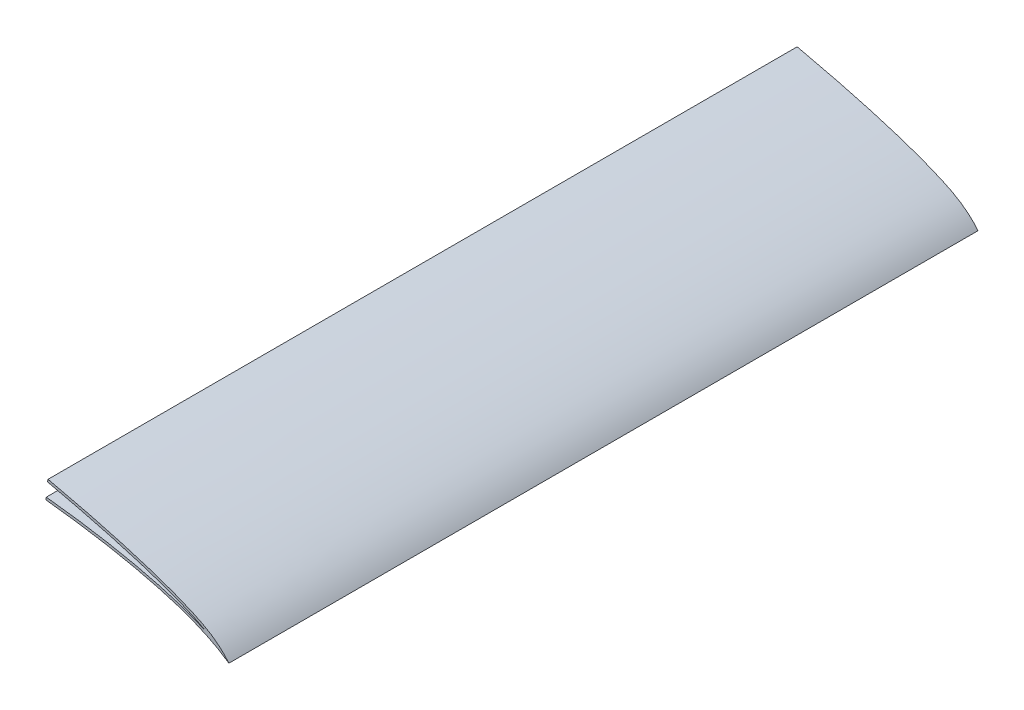
ISO-10303-21;
HEADER;
FILE_DESCRIPTION(('STEP AP214'),'2;1');
FILE_NAME('part.step','',(''),(''),'','','');
FILE_SCHEMA(('AUTOMOTIVE_DESIGN { 1 0 10303 214 1 1 1 1 }'));
ENDSEC;
DATA;
#1=APPLICATION_CONTEXT('core data for automotive mechanical design processes');
#2=APPLICATION_PROTOCOL_DEFINITION('international standard','automotive_design',2000,#1);
#3=PRODUCT_CONTEXT('',#1,'mechanical');
#4=PRODUCT('Part','Part','',(#3));
#5=PRODUCT_RELATED_PRODUCT_CATEGORY('part','',(#4));
#6=PRODUCT_DEFINITION_FORMATION('','',#4);
#7=PRODUCT_DEFINITION_CONTEXT('part definition',#1,'design');
#8=PRODUCT_DEFINITION('design','',#6,#7);
#9=PRODUCT_DEFINITION_SHAPE('','',#8);
#10=(LENGTH_UNIT() NAMED_UNIT(*) SI_UNIT(.MILLI.,.METRE.));
#11=(NAMED_UNIT(*) PLANE_ANGLE_UNIT() SI_UNIT($,.RADIAN.));
#12=(NAMED_UNIT(*) SI_UNIT($,.STERADIAN.) SOLID_ANGLE_UNIT());
#13=UNCERTAINTY_MEASURE_WITH_UNIT(LENGTH_MEASURE(1.E-05),#10,'distance_accuracy_value','');
#14=(GEOMETRIC_REPRESENTATION_CONTEXT(3) GLOBAL_UNCERTAINTY_ASSIGNED_CONTEXT((#13)) GLOBAL_UNIT_ASSIGNED_CONTEXT((#10,
#11,#12)) REPRESENTATION_CONTEXT('',''));
#15=CARTESIAN_POINT('',(0.,0.,0.));
#16=DIRECTION('',(0.,0.,1.));
#17=DIRECTION('',(1.,0.,0.));
#18=AXIS2_PLACEMENT_3D('',#15,#16,#17);
#19=CARTESIAN_POINT('',(681.10239979939,357.442024641771,776.88119407791));
#20=CARTESIAN_POINT('',(679.304249684024,358.507222216952,776.88119407791));
#21=CARTESIAN_POINT('',(675.611115854921,360.442697269166,776.88119407791));
#22=CARTESIAN_POINT('',(667.897968409566,363.914761834944,776.88119407791));
#23=CARTESIAN_POINT('',(658.02890147387,367.768621452563,776.88119407791));
#24=CARTESIAN_POINT('',(645.962941296988,371.875785824504,776.88119407791));
#25=CARTESIAN_POINT('',(629.698668264069,376.857765233191,776.88119407791));
#26=CARTESIAN_POINT('',(609.14271959352,382.390632282122,776.88119407791));
#27=CARTESIAN_POINT('',(592.558644621646,386.308749724352,776.88119407791));
#28=CARTESIAN_POINT('',(584.246414259336,388.168240850974,776.88119407791));
#29=B_SPLINE_CURVE_WITH_KNOTS('',3,(#19,#20,#21,#22,#23,#24,#25,#26,#27,#28),.UNSPECIFIED.,.F.,
.F.,(4,1,1,1,1,1,1,4),(0.0310566948795872,0.0410473310177227,0.0510379671558582,
0.0710192394321292,0.0910005117084002,0.110981783984671,0.150944328537213,0.190906873089755),.UNSPECIFIED.);
#30=DIRECTION('',(0.,0.,-1.));
#31=VECTOR('',#30,1.);
#32=SURFACE_OF_LINEAR_EXTRUSION('',#29,#31);
#33=CARTESIAN_POINT('',(681.10239979939,357.442024641771,319.68119407791));
#34=CARTESIAN_POINT('',(679.304249684024,358.507222216952,319.68119407791));
#35=CARTESIAN_POINT('',(675.611115854921,360.442697269166,319.68119407791));
#36=CARTESIAN_POINT('',(667.897968409566,363.914761834944,319.68119407791));
#37=CARTESIAN_POINT('',(658.02890147387,367.768621452563,319.68119407791));
#38=CARTESIAN_POINT('',(645.962941296988,371.875785824504,319.68119407791));
#39=CARTESIAN_POINT('',(629.698668264069,376.857765233191,319.68119407791));
#40=CARTESIAN_POINT('',(609.14271959352,382.390632282122,319.68119407791));
#41=CARTESIAN_POINT('',(592.558644621646,386.308749724352,319.68119407791));
#42=CARTESIAN_POINT('',(584.246414259336,388.168240850974,319.68119407791));
#43=B_SPLINE_CURVE_WITH_KNOTS('',3,(#33,#34,#35,#36,#37,#38,#39,#40,#41,#42),.UNSPECIFIED.,.F.,
.F.,(4,1,1,1,1,1,1,4),(0.0310566948795872,0.0410473310177227,0.0510379671558582,
0.0710192394321292,0.0910005117084002,0.110981783984671,0.150944328537213,0.190906873089755),.UNSPECIFIED.);
#44=CARTESIAN_POINT('',(681.10239979939,357.442024641771,319.68119407791));
#45=VERTEX_POINT('',#44);
#46=CARTESIAN_POINT('',(584.246414259336,388.168240850974,319.68119407791));
#47=VERTEX_POINT('',#46);
#48=EDGE_CURVE('E148',#45,#47,#43,.T.);
#49=ORIENTED_EDGE('',*,*,#48,.F.);
#50=DIRECTION('',(0.,0.,-1.));
#51=VECTOR('',#50,1.);
#52=CARTESIAN_POINT('',(681.10239979939,357.442024641771,776.88119407791));
#53=LINE('',#52,#51);
#54=CARTESIAN_POINT('',(681.10239979939,357.442024641771,776.88119407791));
#55=VERTEX_POINT('',#54);
#56=EDGE_CURVE('E11',#55,#45,#53,.T.);
#57=ORIENTED_EDGE('',*,*,#56,.F.);
#58=CARTESIAN_POINT('',(584.246414259336,388.168240850974,776.88119407791));
#59=VERTEX_POINT('',#58);
#60=EDGE_CURVE('E155',#55,#59,#29,.T.);
#61=ORIENTED_EDGE('',*,*,#60,.T.);
#62=DIRECTION('',(0.,0.,-1.));
#63=VECTOR('',#62,1.);
#64=CARTESIAN_POINT('',(584.246414259336,388.168240850974,776.88119407791));
#65=LINE('',#64,#63);
#66=EDGE_CURVE('E37',#59,#47,#65,.T.);
#67=ORIENTED_EDGE('',*,*,#66,.T.);
#68=EDGE_LOOP('',(#49,#57,#61,#67));
#69=FACE_BOUND('',#68,.T.);
#70=ADVANCED_FACE('F33',(#69),#32,.T.);
#71=CARTESIAN_POINT('',(583.510331137067,379.741149772631,776.88119407791));
#72=CARTESIAN_POINT('',(591.8136724064,378.84005328922,776.88119407791));
#73=CARTESIAN_POINT('',(608.384907828173,376.714386581783,776.88119407791));
#74=CARTESIAN_POINT('',(633.079929040534,372.32439926868,776.88119407791));
#75=CARTESIAN_POINT('',(653.436794257841,367.438773544325,776.88119407791));
#76=CARTESIAN_POINT('',(669.437307682216,362.364981006689,776.88119407791));
#77=CARTESIAN_POINT('',(677.28280112468,359.2195131916,776.88119407791));
#78=CARTESIAN_POINT('',(681.10239979939,357.442024641771,776.88119407791));
#79=B_SPLINE_CURVE_WITH_KNOTS('',3,(#71,#72,#73,#74,#75,#76,#77,#78),.UNSPECIFIED.,.F.,.F.,(4,1,
1,1,1,4),(0.805836243842012,0.846446639249514,0.887057034657015,0.927667430064517,
0.947972627768268,0.968277825472018),.UNSPECIFIED.);
#80=DIRECTION('',(0.,0.,-1.));
#81=VECTOR('',#80,1.);
#82=SURFACE_OF_LINEAR_EXTRUSION('',#79,#81);
#83=CARTESIAN_POINT('',(583.510331137067,379.741149772631,319.68119407791));
#84=CARTESIAN_POINT('',(591.8136724064,378.84005328922,319.68119407791));
#85=CARTESIAN_POINT('',(608.384907828173,376.714386581783,319.68119407791));
#86=CARTESIAN_POINT('',(633.079929040534,372.32439926868,319.68119407791));
#87=CARTESIAN_POINT('',(653.436794257841,367.438773544325,319.68119407791));
#88=CARTESIAN_POINT('',(669.437307682216,362.364981006689,319.68119407791));
#89=CARTESIAN_POINT('',(677.28280112468,359.2195131916,319.68119407791));
#90=CARTESIAN_POINT('',(681.10239979939,357.442024641771,319.68119407791));
#91=B_SPLINE_CURVE_WITH_KNOTS('',3,(#83,#84,#85,#86,#87,#88,#89,#90),.UNSPECIFIED.,.F.,.F.,(4,1,
1,1,1,4),(0.805836243842012,0.846446639249514,0.887057034657015,0.927667430064517,
0.947972627768268,0.968277825472018),.UNSPECIFIED.);
#92=CARTESIAN_POINT('',(583.510331137067,379.741149772631,319.68119407791));
#93=VERTEX_POINT('',#92);
#94=EDGE_CURVE('E154',#93,#45,#91,.T.);
#95=ORIENTED_EDGE('',*,*,#94,.F.);
#96=DIRECTION('',(0.,0.,-1.));
#97=VECTOR('',#96,1.);
#98=CARTESIAN_POINT('',(583.510331137067,379.741149772631,776.88119407791));
#99=LINE('',#98,#97);
#100=CARTESIAN_POINT('',(583.510331137067,379.741149772631,776.88119407791));
#101=VERTEX_POINT('',#100);
#102=EDGE_CURVE('E43',#101,#93,#99,.T.);
#103=ORIENTED_EDGE('',*,*,#102,.F.);
#104=EDGE_CURVE('E109',#101,#55,#79,.T.);
#105=ORIENTED_EDGE('',*,*,#104,.T.);
#106=ORIENTED_EDGE('',*,*,#56,.T.);
#107=EDGE_LOOP('',(#95,#103,#105,#106));
#108=FACE_BOUND('',#107,.T.);
#109=ADVANCED_FACE('F143',(#108),#82,.T.);
#110=CARTESIAN_POINT('',(583.510331137067,379.741149772631,776.88119407791));
#111=DIRECTION('',(-0.994162977907549,0.107888708204309,0.));
#112=DIRECTION('',(-0.107888708204309,-0.994162977907549,0.));
#113=AXIS2_PLACEMENT_3D('',#110,#111,#112);
#114=PLANE('',#113);
#115=DIRECTION('',(0.107888708204309,0.994162977907549,0.));
#116=VECTOR('',#115,1.);
#117=CARTESIAN_POINT('',(583.510331137067,379.741149772631,319.68119407791));
#118=LINE('',#117,#116);
#119=CARTESIAN_POINT('',(583.339057812792,378.162916045203,319.68119407791));
#120=VERTEX_POINT('',#119);
#121=EDGE_CURVE('E96',#120,#93,#118,.T.);
#122=ORIENTED_EDGE('',*,*,#121,.F.);
#123=DIRECTION('',(0.,0.,-1.));
#124=VECTOR('',#123,1.);
#125=CARTESIAN_POINT('',(583.339057812792,378.162916045203,776.88119407791));
#126=LINE('',#125,#124);
#127=CARTESIAN_POINT('',(583.339057812792,378.162916045203,776.88119407791));
#128=VERTEX_POINT('',#127);
#129=EDGE_CURVE('E91',#128,#120,#126,.T.);
#130=ORIENTED_EDGE('',*,*,#129,.F.);
#131=DIRECTION('',(0.107888708204309,0.994162977907549,0.));
#132=VECTOR('',#131,1.);
#133=CARTESIAN_POINT('',(583.510331137067,379.741149772631,776.88119407791));
#134=LINE('',#133,#132);
#135=EDGE_CURVE('E94',#128,#101,#134,.T.);
#136=ORIENTED_EDGE('',*,*,#135,.T.);
#137=ORIENTED_EDGE('',*,*,#102,.T.);
#138=EDGE_LOOP('',(#122,#130,#136,#137));
#139=FACE_BOUND('',#138,.T.);
#140=ADVANCED_FACE('F93',(#139),#114,.T.);
#141=CARTESIAN_POINT('',(694.960862648591,347.678083459518,776.88119407791));
#142=CARTESIAN_POINT('',(691.029024667533,350.467217019644,776.88119407791));
#143=CARTESIAN_POINT('',(682.671305419235,355.295271927614,776.88119407791));
#144=CARTESIAN_POINT('',(669.098277724682,360.859120529805,776.88119407791));
#145=CARTESIAN_POINT('',(655.150353556945,365.206363312461,776.88119407791));
#146=CARTESIAN_POINT('',(636.268825679498,370.004149324542,776.88119407791));
#147=CARTESIAN_POINT('',(612.334315947761,374.563254744285,776.88119407791));
#148=CARTESIAN_POINT('',(593.01938034853,377.112386588168,776.88119407791));
#149=CARTESIAN_POINT('',(583.339057812792,378.162916045203,776.88119407791));
#150=B_SPLINE_CURVE_WITH_KNOTS('',3,(#141,#142,#143,#144,#145,#146,#147,#148,#149),
.UNSPECIFIED.,.F.,.F.,(4,1,1,1,1,1,4),(0.778364638353046,0.802103786742917,0.825842935132789,
0.84958208352266,0.873321231912532,0.920799528692275,0.968277825472017),.UNSPECIFIED.);
#151=DIRECTION('',(0.,0.,-1.));
#152=VECTOR('',#151,1.);
#153=SURFACE_OF_LINEAR_EXTRUSION('',#150,#152);
#154=CARTESIAN_POINT('',(694.960862648591,347.678083459518,319.68119407791));
#155=CARTESIAN_POINT('',(691.029024667533,350.467217019644,319.68119407791));
#156=CARTESIAN_POINT('',(682.671305419235,355.295271927614,319.68119407791));
#157=CARTESIAN_POINT('',(669.098277724682,360.859120529805,319.68119407791));
#158=CARTESIAN_POINT('',(655.150353556945,365.206363312461,319.68119407791));
#159=CARTESIAN_POINT('',(636.268825679498,370.004149324542,319.68119407791));
#160=CARTESIAN_POINT('',(612.334315947761,374.563254744285,319.68119407791));
#161=CARTESIAN_POINT('',(593.01938034853,377.112386588168,319.68119407791));
#162=CARTESIAN_POINT('',(583.339057812792,378.162916045203,319.68119407791));
#163=B_SPLINE_CURVE_WITH_KNOTS('',3,(#154,#155,#156,#157,#158,#159,#160,#161,#162),
.UNSPECIFIED.,.F.,.F.,(4,1,1,1,1,1,4),(0.778364638353046,0.802103786742917,0.825842935132789,
0.84958208352266,0.873321231912532,0.920799528692275,0.968277825472017),.UNSPECIFIED.);
#164=CARTESIAN_POINT('',(694.960862648591,347.678083459518,319.68119407791));
#165=VERTEX_POINT('',#164);
#166=EDGE_CURVE('E157',#165,#120,#163,.T.);
#167=ORIENTED_EDGE('',*,*,#166,.F.);
#168=DIRECTION('',(0.,0.,-1.));
#169=VECTOR('',#168,1.);
#170=CARTESIAN_POINT('',(694.960862648591,347.678083459518,776.88119407791));
#171=LINE('',#170,#169);
#172=CARTESIAN_POINT('',(694.960862648591,347.678083459518,776.88119407791));
#173=VERTEX_POINT('',#172);
#174=EDGE_CURVE('E101',#173,#165,#171,.T.);
#175=ORIENTED_EDGE('',*,*,#174,.F.);
#176=EDGE_CURVE('E107',#173,#128,#150,.T.);
#177=ORIENTED_EDGE('',*,*,#176,.T.);
#178=ORIENTED_EDGE('',*,*,#129,.T.);
#179=EDGE_LOOP('',(#167,#175,#177,#178));
#180=FACE_BOUND('',#179,.T.);
#181=ADVANCED_FACE('F111',(#180),#153,.T.);
#182=CARTESIAN_POINT('',(584.592980694727,389.717449667067,776.88119407791));
#183=CARTESIAN_POINT('',(594.2390289314,387.559576229826,776.88119407791));
#184=CARTESIAN_POINT('',(608.665062264766,384.125823447073,776.88119407791));
#185=CARTESIAN_POINT('',(627.762599784587,379.000812102591,776.88119407791));
#186=CARTESIAN_POINT('',(641.985832617223,374.815696622757,776.88119407791));
#187=CARTESIAN_POINT('',(653.728443854595,370.955138889617,776.88119407791));
#188=CARTESIAN_POINT('',(663.00422729933,367.537908093301,776.88119407791));
#189=CARTESIAN_POINT('',(669.877072896808,364.763096926528,776.88119407791));
#190=CARTESIAN_POINT('',(676.654462618841,361.727818738977,776.88119407791));
#191=CARTESIAN_POINT('',(682.087698437832,358.81395797082,776.88119407791));
#192=CARTESIAN_POINT('',(686.264097225263,356.011835466178,776.88119407791));
#193=CARTESIAN_POINT('',(689.293606327259,353.621302194878,776.88119407791));
#194=CARTESIAN_POINT('',(691.722959725977,351.338504762297,776.88119407791));
#195=CARTESIAN_POINT('',(693.593228521658,349.322103903293,776.88119407791));
#196=CARTESIAN_POINT('',(694.516463088209,348.229332832381,776.88119407791));
#197=CARTESIAN_POINT('',(694.960862648591,347.678083459518,776.88119407791));
#198=B_SPLINE_CURVE_WITH_KNOTS('',3,(#182,#183,#184,#185,#186,#187,#188,#189,#190,#191,#192,
#193,#194,#195,#196,#197),.UNSPECIFIED.,.F.,.F.,(4,1,1,1,1,1,1,1,1,1,1,1,1,4),
(0.0310566948795878,0.0773530996556797,0.100501302043726,0.123649504431772,0.146797706819817,
0.15837180801384,0.169945909207863,0.181520010401886,0.193094111595909,0.198881162192921,
0.204668212789932,0.210455263386944,0.213348788685449,0.216242313983955),.UNSPECIFIED.);
#199=DIRECTION('',(0.,0.,-1.));
#200=VECTOR('',#199,1.);
#201=SURFACE_OF_LINEAR_EXTRUSION('',#198,#200);
#202=CARTESIAN_POINT('',(584.592980694727,389.717449667067,319.68119407791));
#203=CARTESIAN_POINT('',(594.2390289314,387.559576229826,319.68119407791));
#204=CARTESIAN_POINT('',(608.665062264766,384.125823447073,319.68119407791));
#205=CARTESIAN_POINT('',(627.762599784587,379.000812102591,319.68119407791));
#206=CARTESIAN_POINT('',(641.985832617223,374.815696622757,319.68119407791));
#207=CARTESIAN_POINT('',(653.728443854595,370.955138889617,319.68119407791));
#208=CARTESIAN_POINT('',(663.00422729933,367.537908093301,319.68119407791));
#209=CARTESIAN_POINT('',(669.877072896808,364.763096926528,319.68119407791));
#210=CARTESIAN_POINT('',(676.654462618841,361.727818738977,319.68119407791));
#211=CARTESIAN_POINT('',(682.087698437832,358.81395797082,319.68119407791));
#212=CARTESIAN_POINT('',(686.264097225263,356.011835466178,319.68119407791));
#213=CARTESIAN_POINT('',(689.293606327259,353.621302194878,319.68119407791));
#214=CARTESIAN_POINT('',(691.722959725977,351.338504762297,319.68119407791));
#215=CARTESIAN_POINT('',(693.593228521658,349.322103903293,319.68119407791));
#216=CARTESIAN_POINT('',(694.516463088209,348.229332832381,319.68119407791));
#217=CARTESIAN_POINT('',(694.960862648591,347.678083459518,319.68119407791));
#218=B_SPLINE_CURVE_WITH_KNOTS('',3,(#202,#203,#204,#205,#206,#207,#208,#209,#210,#211,#212,
#213,#214,#215,#216,#217),.UNSPECIFIED.,.F.,.F.,(4,1,1,1,1,1,1,1,1,1,1,1,1,4),
(0.0310566948795878,0.0773530996556797,0.100501302043726,0.123649504431772,0.146797706819817,
0.15837180801384,0.169945909207863,0.181520010401886,0.193094111595909,0.198881162192921,
0.204668212789932,0.210455263386944,0.213348788685449,0.216242313983955),.UNSPECIFIED.);
#219=CARTESIAN_POINT('',(584.592980694727,389.717449667067,319.68119407791));
#220=VERTEX_POINT('',#219);
#221=EDGE_CURVE('E229',#220,#165,#218,.T.);
#222=ORIENTED_EDGE('',*,*,#221,.F.);
#223=DIRECTION('',(0.,0.,-1.));
#224=VECTOR('',#223,1.);
#225=CARTESIAN_POINT('',(584.592980694727,389.717449667067,776.88119407791));
#226=LINE('',#225,#224);
#227=CARTESIAN_POINT('',(584.592980694727,389.717449667067,776.88119407791));
#228=VERTEX_POINT('',#227);
#229=EDGE_CURVE('E167',#228,#220,#226,.T.);
#230=ORIENTED_EDGE('',*,*,#229,.F.);
#231=EDGE_CURVE('E112',#228,#173,#198,.T.);
#232=ORIENTED_EDGE('',*,*,#231,.T.);
#233=ORIENTED_EDGE('',*,*,#174,.T.);
#234=EDGE_LOOP('',(#222,#230,#232,#233));
#235=FACE_BOUND('',#234,.T.);
#236=ADVANCED_FACE('F131',(#235),#201,.T.);
#237=CARTESIAN_POINT('',(584.246414259336,388.168240850974,776.88119407791));
#238=DIRECTION('',(-0.975879569192483,0.218309565600535,0.));
#239=DIRECTION('',(-0.218309565600535,-0.975879569192483,0.));
#240=AXIS2_PLACEMENT_3D('',#237,#238,#239);
#241=PLANE('',#240);
#242=DIRECTION('',(0.218309565600535,0.975879569192483,0.));
#243=VECTOR('',#242,1.);
#244=CARTESIAN_POINT('',(584.246414259336,388.168240850974,319.68119407791));
#245=LINE('',#244,#243);
#246=EDGE_CURVE('E152',#47,#220,#245,.T.);
#247=ORIENTED_EDGE('',*,*,#246,.F.);
#248=ORIENTED_EDGE('',*,*,#66,.F.);
#249=DIRECTION('',(0.218309565600535,0.975879569192483,0.));
#250=VECTOR('',#249,1.);
#251=CARTESIAN_POINT('',(584.246414259336,388.168240850974,776.88119407791));
#252=LINE('',#251,#250);
#253=EDGE_CURVE('E114',#59,#228,#252,.T.);
#254=ORIENTED_EDGE('',*,*,#253,.T.);
#255=ORIENTED_EDGE('',*,*,#229,.T.);
#256=EDGE_LOOP('',(#247,#248,#254,#255));
#257=FACE_BOUND('',#256,.T.);
#258=ADVANCED_FACE('F134',(#257),#241,.T.);
#259=CARTESIAN_POINT('',(633.749696030339,375.565963233557,776.88119407791));
#260=DIRECTION('',(0.,0.,1.));
#261=DIRECTION('',(1.,0.,0.));
#262=AXIS2_PLACEMENT_3D('',#259,#260,#261);
#263=PLANE('',#262);
#264=ORIENTED_EDGE('',*,*,#60,.F.);
#265=ORIENTED_EDGE('',*,*,#104,.F.);
#266=ORIENTED_EDGE('',*,*,#135,.F.);
#267=ORIENTED_EDGE('',*,*,#176,.F.);
#268=ORIENTED_EDGE('',*,*,#231,.F.);
#269=ORIENTED_EDGE('',*,*,#253,.F.);
#270=EDGE_LOOP('',(#264,#265,#266,#267,#268,#269));
#271=FACE_BOUND('',#270,.T.);
#272=ADVANCED_FACE('F105',(#271),#263,.T.);
#273=CARTESIAN_POINT('',(633.749696030339,375.565963233557,319.68119407791));
#274=DIRECTION('',(0.,0.,1.));
#275=DIRECTION('',(1.,0.,0.));
#276=AXIS2_PLACEMENT_3D('',#273,#274,#275);
#277=PLANE('',#276);
#278=ORIENTED_EDGE('',*,*,#48,.T.);
#279=ORIENTED_EDGE('',*,*,#246,.T.);
#280=ORIENTED_EDGE('',*,*,#221,.T.);
#281=ORIENTED_EDGE('',*,*,#166,.T.);
#282=ORIENTED_EDGE('',*,*,#121,.T.);
#283=ORIENTED_EDGE('',*,*,#94,.T.);
#284=EDGE_LOOP('',(#278,#279,#280,#281,#282,#283));
#285=FACE_BOUND('',#284,.T.);
#286=ADVANCED_FACE('F140',(#285),#277,.F.);
#287=CLOSED_SHELL('',(#70,#109,#140,#181,#236,#258,#272,#286));
#288=MANIFOLD_SOLID_BREP('B2',#287);
#289=ADVANCED_BREP_SHAPE_REPRESENTATION('',(#18,#288),#14);
#290=SHAPE_DEFINITION_REPRESENTATION(#9,#289);
ENDSEC;
END-ISO-10303-21;
